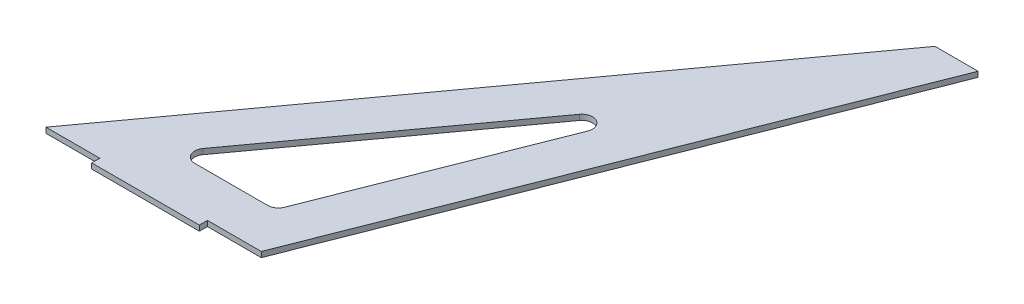
ISO-10303-21;
HEADER;
FILE_DESCRIPTION(('STEP AP214'),'2;1');
FILE_NAME('part.step','',(''),(''),'','','');
FILE_SCHEMA(('AUTOMOTIVE_DESIGN { 1 0 10303 214 1 1 1 1 }'));
ENDSEC;
DATA;
#1=APPLICATION_CONTEXT('core data for automotive mechanical design processes');
#2=APPLICATION_PROTOCOL_DEFINITION('international standard','automotive_design',2000,#1);
#3=PRODUCT_CONTEXT('',#1,'mechanical');
#4=PRODUCT('Part','Part','',(#3));
#5=PRODUCT_RELATED_PRODUCT_CATEGORY('part','',(#4));
#6=PRODUCT_DEFINITION_FORMATION('','',#4);
#7=PRODUCT_DEFINITION_CONTEXT('part definition',#1,'design');
#8=PRODUCT_DEFINITION('design','',#6,#7);
#9=PRODUCT_DEFINITION_SHAPE('','',#8);
#10=(LENGTH_UNIT() NAMED_UNIT(*) SI_UNIT(.MILLI.,.METRE.));
#11=(NAMED_UNIT(*) PLANE_ANGLE_UNIT() SI_UNIT($,.RADIAN.));
#12=(NAMED_UNIT(*) SI_UNIT($,.STERADIAN.) SOLID_ANGLE_UNIT());
#13=UNCERTAINTY_MEASURE_WITH_UNIT(LENGTH_MEASURE(1.E-05),#10,'distance_accuracy_value','');
#14=(GEOMETRIC_REPRESENTATION_CONTEXT(3) GLOBAL_UNCERTAINTY_ASSIGNED_CONTEXT((#13)) GLOBAL_UNIT_ASSIGNED_CONTEXT((#10,
#11,#12)) REPRESENTATION_CONTEXT('',''));
#15=CARTESIAN_POINT('',(0.,0.,0.));
#16=DIRECTION('',(0.,0.,1.));
#17=DIRECTION('',(1.,0.,0.));
#18=AXIS2_PLACEMENT_3D('',#15,#16,#17);
#19=CARTESIAN_POINT('',(-119.32539,3.175,0.));
#20=DIRECTION('',(0.,0.,-1.));
#21=DIRECTION('',(-1.,0.,0.));
#22=AXIS2_PLACEMENT_3D('',#19,#20,#21);
#23=PLANE('',#22);
#24=DIRECTION('',(0.,1.,0.));
#25=VECTOR('',#24,1.);
#26=CARTESIAN_POINT('',(-151.07539,3.175,0.));
#27=LINE('',#26,#25);
#28=CARTESIAN_POINT('',(-151.07539,0.,0.));
#29=VERTEX_POINT('',#28);
#30=CARTESIAN_POINT('',(-151.07539,3.175,0.));
#31=VERTEX_POINT('',#30);
#32=EDGE_CURVE('E161',#29,#31,#27,.T.);
#33=ORIENTED_EDGE('',*,*,#32,.F.);
#34=DIRECTION('',(1.,0.,0.));
#35=VECTOR('',#34,1.);
#36=CARTESIAN_POINT('',(-119.32539,0.,0.));
#37=LINE('',#36,#35);
#38=CARTESIAN_POINT('',(-119.32539,0.,0.));
#39=VERTEX_POINT('',#38);
#40=EDGE_CURVE('E202',#29,#39,#37,.T.);
#41=ORIENTED_EDGE('',*,*,#40,.T.);
#42=DIRECTION('',(0.,-1.,0.));
#43=VECTOR('',#42,1.);
#44=CARTESIAN_POINT('',(-119.32539,3.175,0.));
#45=LINE('',#44,#43);
#46=CARTESIAN_POINT('',(-119.32539,3.175,0.));
#47=VERTEX_POINT('',#46);
#48=EDGE_CURVE('E195',#47,#39,#45,.T.);
#49=ORIENTED_EDGE('',*,*,#48,.F.);
#50=DIRECTION('',(1.,0.,0.));
#51=VECTOR('',#50,1.);
#52=CARTESIAN_POINT('',(-119.32539,3.175,0.));
#53=LINE('',#52,#51);
#54=EDGE_CURVE('E53',#31,#47,#53,.T.);
#55=ORIENTED_EDGE('',*,*,#54,.F.);
#56=EDGE_LOOP('',(#33,#41,#49,#55));
#57=FACE_BOUND('',#56,.T.);
#58=ADVANCED_FACE('F38',(#57),#23,.F.);
#59=DIRECTION('',(0.,-1.,0.));
#60=VECTOR('',#59,1.);
#61=CARTESIAN_POINT('',(-214.57539,3.175,0.));
#62=LINE('',#61,#60);
#63=CARTESIAN_POINT('',(-214.57539,3.175,0.));
#64=VERTEX_POINT('',#63);
#65=CARTESIAN_POINT('',(-214.57539,0.,0.));
#66=VERTEX_POINT('',#65);
#67=EDGE_CURVE('E61',#64,#66,#62,.T.);
#68=ORIENTED_EDGE('',*,*,#67,.F.);
#69=CARTESIAN_POINT('',(-246.32539,3.175,0.));
#70=VERTEX_POINT('',#69);
#71=EDGE_CURVE('E193',#70,#64,#53,.T.);
#72=ORIENTED_EDGE('',*,*,#71,.F.);
#73=DIRECTION('',(0.,-1.,0.));
#74=VECTOR('',#73,1.);
#75=CARTESIAN_POINT('',(-246.32539,3.175,0.));
#76=LINE('',#75,#74);
#77=CARTESIAN_POINT('',(-246.32539,0.,0.));
#78=VERTEX_POINT('',#77);
#79=EDGE_CURVE('E206',#70,#78,#76,.T.);
#80=ORIENTED_EDGE('',*,*,#79,.T.);
#81=EDGE_CURVE('E189',#78,#66,#37,.T.);
#82=ORIENTED_EDGE('',*,*,#81,.T.);
#83=EDGE_LOOP('',(#68,#72,#80,#82));
#84=FACE_BOUND('',#83,.T.);
#85=ADVANCED_FACE('F276',(#84),#23,.F.);
#86=CARTESIAN_POINT('',(0.,3.175,-303.52288512952));
#87=DIRECTION('',(-0.930663542600388,0.,-0.365876168224299));
#88=DIRECTION('',(-0.365876168224299,0.,0.930663542600388));
#89=AXIS2_PLACEMENT_3D('',#86,#87,#88);
#90=PLANE('',#89);
#91=DIRECTION('',(0.365876168224299,0.,-0.930663542600388));
#92=VECTOR('',#91,1.);
#93=CARTESIAN_POINT('',(0.,0.,-303.52288512952));
#94=LINE('',#93,#92);
#95=CARTESIAN_POINT('',(0.,0.,-303.52288512952));
#96=VERTEX_POINT('',#95);
#97=EDGE_CURVE('E180',#39,#96,#94,.T.);
#98=ORIENTED_EDGE('',*,*,#97,.T.);
#99=DIRECTION('',(0.,-1.,0.));
#100=VECTOR('',#99,1.);
#101=CARTESIAN_POINT('',(0.,3.175,-303.52288512952));
#102=LINE('',#101,#100);
#103=CARTESIAN_POINT('',(0.,3.175,-303.52288512952));
#104=VERTEX_POINT('',#103);
#105=EDGE_CURVE('E212',#104,#96,#102,.T.);
#106=ORIENTED_EDGE('',*,*,#105,.F.);
#107=DIRECTION('',(0.365876168224299,0.,-0.930663542600388));
#108=VECTOR('',#107,1.);
#109=CARTESIAN_POINT('',(0.,3.175,-303.52288512952));
#110=LINE('',#109,#108);
#111=EDGE_CURVE('E186',#47,#104,#110,.T.);
#112=ORIENTED_EDGE('',*,*,#111,.F.);
#113=ORIENTED_EDGE('',*,*,#48,.T.);
#114=EDGE_LOOP('',(#98,#106,#112,#113));
#115=FACE_BOUND('',#114,.T.);
#116=ADVANCED_FACE('F281',(#115),#90,.F.);
#117=CARTESIAN_POINT('',(-25.4,3.175,-303.52288512952));
#118=DIRECTION('',(0.,0.,1.));
#119=DIRECTION('',(1.,0.,0.));
#120=AXIS2_PLACEMENT_3D('',#117,#118,#119);
#121=PLANE('',#120);
#122=DIRECTION('',(-1.,0.,0.));
#123=VECTOR('',#122,1.);
#124=CARTESIAN_POINT('',(-25.4,0.,-303.52288512952));
#125=LINE('',#124,#123);
#126=CARTESIAN_POINT('',(-25.4,0.,-303.52288512952));
#127=VERTEX_POINT('',#126);
#128=EDGE_CURVE('E198',#96,#127,#125,.T.);
#129=ORIENTED_EDGE('',*,*,#128,.T.);
#130=DIRECTION('',(0.,-1.,0.));
#131=VECTOR('',#130,1.);
#132=CARTESIAN_POINT('',(-25.4,3.175,-303.52288512952));
#133=LINE('',#132,#131);
#134=CARTESIAN_POINT('',(-25.4,3.175,-303.52288512952));
#135=VERTEX_POINT('',#134);
#136=EDGE_CURVE('E209',#135,#127,#133,.T.);
#137=ORIENTED_EDGE('',*,*,#136,.F.);
#138=DIRECTION('',(-1.,0.,0.));
#139=VECTOR('',#138,1.);
#140=CARTESIAN_POINT('',(-25.4,3.175,-303.52288512952));
#141=LINE('',#140,#139);
#142=EDGE_CURVE('E188',#104,#135,#141,.T.);
#143=ORIENTED_EDGE('',*,*,#142,.F.);
#144=ORIENTED_EDGE('',*,*,#105,.T.);
#145=EDGE_LOOP('',(#129,#137,#143,#144));
#146=FACE_BOUND('',#145,.T.);
#147=ADVANCED_FACE('F288',(#146),#121,.F.);
#148=CARTESIAN_POINT('',(-246.32539,3.175,0.));
#149=DIRECTION('',(0.808506081663666,0.,0.588487821380243));
#150=DIRECTION('',(0.588487821380244,0.,-0.808506081663666));
#151=AXIS2_PLACEMENT_3D('',#148,#149,#150);
#152=PLANE('',#151);
#153=DIRECTION('',(-0.588487821380243,0.,0.808506081663666));
#154=VECTOR('',#153,1.);
#155=CARTESIAN_POINT('',(-246.32539,0.,0.));
#156=LINE('',#155,#154);
#157=EDGE_CURVE('E200',#127,#78,#156,.T.);
#158=ORIENTED_EDGE('',*,*,#157,.T.);
#159=ORIENTED_EDGE('',*,*,#79,.F.);
#160=DIRECTION('',(-0.588487821380243,0.,0.808506081663666));
#161=VECTOR('',#160,1.);
#162=CARTESIAN_POINT('',(-246.32539,3.175,0.));
#163=LINE('',#162,#161);
#164=EDGE_CURVE('E191',#135,#70,#163,.T.);
#165=ORIENTED_EDGE('',*,*,#164,.F.);
#166=ORIENTED_EDGE('',*,*,#136,.T.);
#167=EDGE_LOOP('',(#158,#159,#165,#166));
#168=FACE_BOUND('',#167,.T.);
#169=ADVANCED_FACE('F285',(#168),#152,.F.);
#170=CARTESIAN_POINT('',(0.,3.175,0.));
#171=DIRECTION('',(0.,-1.,0.));
#172=DIRECTION('',(0.,0.,-1.));
#173=AXIS2_PLACEMENT_3D('',#170,#171,#172);
#174=PLANE('',#173);
#175=DIRECTION('',(0.3658761682243,0.,-0.930663542600388));
#176=VECTOR('',#175,1.);
#177=CARTESIAN_POINT('',(-136.632122873728,3.175,-25.4));
#178=LINE('',#177,#176);
#179=CARTESIAN_POINT('',(-135.049092596648,3.175,-29.4266863317757));
#180=VERTEX_POINT('',#179);
#181=CARTESIAN_POINT('',(-84.5627859593246,3.175,-157.846542743677));
#182=VERTEX_POINT('',#181);
#183=EDGE_CURVE('E165',#180,#182,#178,.T.);
#184=ORIENTED_EDGE('',*,*,#183,.F.);
#185=CARTESIAN_POINT('',(-140.958806092161,3.175,-31.75));
#186=DIRECTION('',(0.,-1.,0.));
#187=DIRECTION('',(0.,0.,-1.));
#188=AXIS2_PLACEMENT_3D('',#185,#186,#187);
#189=CIRCLE('',#188,6.35);
#190=CARTESIAN_POINT('',(-140.958806092161,3.175,-25.4));
#191=VERTEX_POINT('',#190);
#192=EDGE_CURVE('E230',#180,#191,#189,.T.);
#193=ORIENTED_EDGE('',*,*,#192,.T.);
#194=DIRECTION('',(1.,0.,0.));
#195=VECTOR('',#194,1.);
#196=CARTESIAN_POINT('',(-196.42150977187,3.175,-25.4));
#197=LINE('',#196,#195);
#198=CARTESIAN_POINT('',(-183.945539714838,3.175,-25.4));
#199=VERTEX_POINT('',#198);
#200=EDGE_CURVE('E162',#199,#191,#197,.T.);
#201=ORIENTED_EDGE('',*,*,#200,.F.);
#202=CARTESIAN_POINT('',(-183.945539714838,3.175,-31.75));
#203=DIRECTION('',(0.,-1.,0.));
#204=DIRECTION('',(0.,0.,-1.));
#205=AXIS2_PLACEMENT_3D('',#202,#203,#204);
#206=CIRCLE('',#205,6.35);
#207=CARTESIAN_POINT('',(-189.079553333402,3.175,-35.4868976657646));
#208=VERTEX_POINT('',#207);
#209=EDGE_CURVE('E234',#199,#208,#206,.T.);
#210=ORIENTED_EDGE('',*,*,#209,.T.);
#211=DIRECTION('',(-0.588487821380243,0.,0.808506081663666));
#212=VECTOR('',#211,1.);
#213=CARTESIAN_POINT('',(-66.4117300638694,3.175,-204.016606411901));
#214=LINE('',#213,#212);
#215=CARTESIAN_POINT('',(-95.6065130734013,3.175,-163.906754077666));
#216=VERTEX_POINT('',#215);
#217=EDGE_CURVE('E175',#216,#208,#214,.T.);
#218=ORIENTED_EDGE('',*,*,#217,.F.);
#219=CARTESIAN_POINT('',(-90.472499454837,3.175,-160.169856411901));
#220=DIRECTION('',(0.,-1.,0.));
#221=DIRECTION('',(0.,0.,-1.));
#222=AXIS2_PLACEMENT_3D('',#219,#220,#221);
#223=CIRCLE('',#222,6.35);
#224=EDGE_CURVE('E46',#216,#182,#223,.T.);
#225=ORIENTED_EDGE('',*,*,#224,.T.);
#226=EDGE_LOOP('',(#184,#193,#201,#210,#218,#225));
#227=FACE_BOUND('',#226,.T.);
#228=ORIENTED_EDGE('',*,*,#111,.T.);
#229=ORIENTED_EDGE('',*,*,#142,.T.);
#230=ORIENTED_EDGE('',*,*,#164,.T.);
#231=ORIENTED_EDGE('',*,*,#71,.T.);
#232=DIRECTION('',(0.,0.,-1.));
#233=VECTOR('',#232,1.);
#234=CARTESIAN_POINT('',(-214.57539,3.175,4.7625));
#235=LINE('',#234,#233);
#236=CARTESIAN_POINT('',(-214.57539,3.175,4.7625));
#237=VERTEX_POINT('',#236);
#238=EDGE_CURVE('E146',#237,#64,#235,.T.);
#239=ORIENTED_EDGE('',*,*,#238,.F.);
#240=DIRECTION('',(-1.,0.,0.));
#241=VECTOR('',#240,1.);
#242=CARTESIAN_POINT('',(-214.57539,3.175,4.7625));
#243=LINE('',#242,#241);
#244=CARTESIAN_POINT('',(-151.07539,3.175,4.7625));
#245=VERTEX_POINT('',#244);
#246=EDGE_CURVE('E138',#245,#237,#243,.T.);
#247=ORIENTED_EDGE('',*,*,#246,.F.);
#248=DIRECTION('',(0.,0.,-1.));
#249=VECTOR('',#248,1.);
#250=CARTESIAN_POINT('',(-151.07539,3.175,4.7625));
#251=LINE('',#250,#249);
#252=EDGE_CURVE('E143',#245,#31,#251,.T.);
#253=ORIENTED_EDGE('',*,*,#252,.T.);
#254=ORIENTED_EDGE('',*,*,#54,.T.);
#255=EDGE_LOOP('',(#228,#229,#230,#231,#239,#247,#253,#254));
#256=FACE_BOUND('',#255,.T.);
#257=ADVANCED_FACE('F141',(#227,#256),#174,.F.);
#258=CARTESIAN_POINT('',(0.,0.,0.));
#259=DIRECTION('',(0.,-1.,0.));
#260=DIRECTION('',(0.,0.,-1.));
#261=AXIS2_PLACEMENT_3D('',#258,#259,#260);
#262=PLANE('',#261);
#263=DIRECTION('',(-0.588487821380243,0.,0.808506081663666));
#264=VECTOR('',#263,1.);
#265=CARTESIAN_POINT('',(-66.4117300638694,0.,-204.016606411901));
#266=LINE('',#265,#264);
#267=CARTESIAN_POINT('',(-95.6065130734013,0.,-163.906754077666));
#268=VERTEX_POINT('',#267);
#269=CARTESIAN_POINT('',(-189.079553333402,0.,-35.4868976657646));
#270=VERTEX_POINT('',#269);
#271=EDGE_CURVE('E178',#268,#270,#266,.T.);
#272=ORIENTED_EDGE('',*,*,#271,.T.);
#273=CARTESIAN_POINT('',(-183.945539714838,0.,-31.75));
#274=DIRECTION('',(0.,-1.,0.));
#275=DIRECTION('',(0.,0.,-1.));
#276=AXIS2_PLACEMENT_3D('',#273,#274,#275);
#277=CIRCLE('',#276,6.35);
#278=CARTESIAN_POINT('',(-183.945539714838,0.,-25.4));
#279=VERTEX_POINT('',#278);
#280=EDGE_CURVE('E236',#270,#279,#277,.F.);
#281=ORIENTED_EDGE('',*,*,#280,.T.);
#282=DIRECTION('',(1.,0.,0.));
#283=VECTOR('',#282,1.);
#284=CARTESIAN_POINT('',(-196.42150977187,0.,-25.4));
#285=LINE('',#284,#283);
#286=CARTESIAN_POINT('',(-140.958806092161,0.,-25.4));
#287=VERTEX_POINT('',#286);
#288=EDGE_CURVE('E171',#279,#287,#285,.T.);
#289=ORIENTED_EDGE('',*,*,#288,.T.);
#290=CARTESIAN_POINT('',(-140.958806092161,0.,-31.75));
#291=DIRECTION('',(0.,-1.,0.));
#292=DIRECTION('',(0.,0.,-1.));
#293=AXIS2_PLACEMENT_3D('',#290,#291,#292);
#294=CIRCLE('',#293,6.35);
#295=CARTESIAN_POINT('',(-135.049092596648,0.,-29.4266863317757));
#296=VERTEX_POINT('',#295);
#297=EDGE_CURVE('E232',#287,#296,#294,.F.);
#298=ORIENTED_EDGE('',*,*,#297,.T.);
#299=DIRECTION('',(0.3658761682243,0.,-0.930663542600388));
#300=VECTOR('',#299,1.);
#301=CARTESIAN_POINT('',(-136.632122873728,0.,-25.4));
#302=LINE('',#301,#300);
#303=CARTESIAN_POINT('',(-84.5627859593246,0.,-157.846542743677));
#304=VERTEX_POINT('',#303);
#305=EDGE_CURVE('E174',#296,#304,#302,.T.);
#306=ORIENTED_EDGE('',*,*,#305,.T.);
#307=CARTESIAN_POINT('',(-90.472499454837,0.,-160.169856411901));
#308=DIRECTION('',(0.,-1.,0.));
#309=DIRECTION('',(0.,0.,-1.));
#310=AXIS2_PLACEMENT_3D('',#307,#308,#309);
#311=CIRCLE('',#310,6.35);
#312=EDGE_CURVE('E11',#304,#268,#311,.F.);
#313=ORIENTED_EDGE('',*,*,#312,.T.);
#314=EDGE_LOOP('',(#272,#281,#289,#298,#306,#313));
#315=FACE_BOUND('',#314,.T.);
#316=ORIENTED_EDGE('',*,*,#97,.F.);
#317=ORIENTED_EDGE('',*,*,#40,.F.);
#318=DIRECTION('',(0.,0.,-1.));
#319=VECTOR('',#318,1.);
#320=CARTESIAN_POINT('',(-151.07539,0.,4.7625));
#321=LINE('',#320,#319);
#322=CARTESIAN_POINT('',(-151.07539,0.,4.7625));
#323=VERTEX_POINT('',#322);
#324=EDGE_CURVE('E309',#323,#29,#321,.T.);
#325=ORIENTED_EDGE('',*,*,#324,.F.);
#326=DIRECTION('',(1.,0.,0.));
#327=VECTOR('',#326,1.);
#328=CARTESIAN_POINT('',(-214.57539,0.,4.7625));
#329=LINE('',#328,#327);
#330=CARTESIAN_POINT('',(-214.57539,0.,4.7625));
#331=VERTEX_POINT('',#330);
#332=EDGE_CURVE('E155',#331,#323,#329,.T.);
#333=ORIENTED_EDGE('',*,*,#332,.F.);
#334=DIRECTION('',(0.,0.,-1.));
#335=VECTOR('',#334,1.);
#336=CARTESIAN_POINT('',(-214.57539,0.,4.7625));
#337=LINE('',#336,#335);
#338=EDGE_CURVE('E167',#331,#66,#337,.T.);
#339=ORIENTED_EDGE('',*,*,#338,.T.);
#340=ORIENTED_EDGE('',*,*,#81,.F.);
#341=ORIENTED_EDGE('',*,*,#157,.F.);
#342=ORIENTED_EDGE('',*,*,#128,.F.);
#343=EDGE_LOOP('',(#316,#317,#325,#333,#339,#340,#341,#342));
#344=FACE_BOUND('',#343,.T.);
#345=ADVANCED_FACE('F250',(#315,#344),#262,.T.);
#346=CARTESIAN_POINT('',(-196.42150977187,0.,-25.4));
#347=DIRECTION('',(0.,0.,1.));
#348=DIRECTION('',(1.,0.,0.));
#349=AXIS2_PLACEMENT_3D('',#346,#347,#348);
#350=PLANE('',#349);
#351=ORIENTED_EDGE('',*,*,#200,.T.);
#352=DIRECTION('',(0.,1.,0.));
#353=VECTOR('',#352,1.);
#354=CARTESIAN_POINT('',(-140.958806092161,0.,-25.4));
#355=LINE('',#354,#353);
#356=EDGE_CURVE('E223',#191,#287,#355,.F.);
#357=ORIENTED_EDGE('',*,*,#356,.T.);
#358=ORIENTED_EDGE('',*,*,#288,.F.);
#359=DIRECTION('',(0.,1.,0.));
#360=VECTOR('',#359,1.);
#361=CARTESIAN_POINT('',(-183.945539714838,3.175,-25.4));
#362=LINE('',#361,#360);
#363=EDGE_CURVE('E220',#279,#199,#362,.T.);
#364=ORIENTED_EDGE('',*,*,#363,.T.);
#365=EDGE_LOOP('',(#351,#357,#358,#364));
#366=FACE_BOUND('',#365,.T.);
#367=ADVANCED_FACE('F262',(#366),#350,.F.);
#368=CARTESIAN_POINT('',(-66.4117300638694,0.,-204.016606411901));
#369=DIRECTION('',(-0.808506081663666,0.,-0.588487821380243));
#370=DIRECTION('',(-0.588487821380243,0.,0.808506081663667));
#371=AXIS2_PLACEMENT_3D('',#368,#369,#370);
#372=PLANE('',#371);
#373=ORIENTED_EDGE('',*,*,#217,.T.);
#374=DIRECTION('',(0.,1.,0.));
#375=VECTOR('',#374,1.);
#376=CARTESIAN_POINT('',(-189.079553333402,0.,-35.4868976657646));
#377=LINE('',#376,#375);
#378=EDGE_CURVE('E228',#208,#270,#377,.F.);
#379=ORIENTED_EDGE('',*,*,#378,.T.);
#380=ORIENTED_EDGE('',*,*,#271,.F.);
#381=DIRECTION('',(0.,1.,0.));
#382=VECTOR('',#381,1.);
#383=CARTESIAN_POINT('',(-95.6065130734013,3.175,-163.906754077666));
#384=LINE('',#383,#382);
#385=EDGE_CURVE('E225',#268,#216,#384,.T.);
#386=ORIENTED_EDGE('',*,*,#385,.T.);
#387=EDGE_LOOP('',(#373,#379,#380,#386));
#388=FACE_BOUND('',#387,.T.);
#389=ADVANCED_FACE('F254',(#388),#372,.F.);
#390=CARTESIAN_POINT('',(-136.632122873728,0.,-25.4));
#391=DIRECTION('',(0.930663542600388,0.,0.3658761682243));
#392=DIRECTION('',(0.3658761682243,0.,-0.930663542600388));
#393=AXIS2_PLACEMENT_3D('',#390,#391,#392);
#394=PLANE('',#393);
#395=ORIENTED_EDGE('',*,*,#305,.F.);
#396=DIRECTION('',(0.,1.,0.));
#397=VECTOR('',#396,1.);
#398=CARTESIAN_POINT('',(-135.049092596648,3.175,-29.4266863317757));
#399=LINE('',#398,#397);
#400=EDGE_CURVE('E217',#296,#180,#399,.T.);
#401=ORIENTED_EDGE('',*,*,#400,.T.);
#402=ORIENTED_EDGE('',*,*,#183,.T.);
#403=DIRECTION('',(0.,1.,0.));
#404=VECTOR('',#403,1.);
#405=CARTESIAN_POINT('',(-84.5627859593246,0.,-157.846542743677));
#406=LINE('',#405,#404);
#407=EDGE_CURVE('E215',#182,#304,#406,.F.);
#408=ORIENTED_EDGE('',*,*,#407,.T.);
#409=EDGE_LOOP('',(#395,#401,#402,#408));
#410=FACE_BOUND('',#409,.T.);
#411=ADVANCED_FACE('F245',(#410),#394,.F.);
#412=CARTESIAN_POINT('',(-140.958806092161,0.,-31.75));
#413=DIRECTION('',(0.,-1.,0.));
#414=DIRECTION('',(0.,0.,-1.));
#415=AXIS2_PLACEMENT_3D('',#412,#413,#414);
#416=CYLINDRICAL_SURFACE('',#415,6.35);
#417=ORIENTED_EDGE('',*,*,#297,.F.);
#418=ORIENTED_EDGE('',*,*,#356,.F.);
#419=ORIENTED_EDGE('',*,*,#192,.F.);
#420=ORIENTED_EDGE('',*,*,#400,.F.);
#421=EDGE_LOOP('',(#417,#418,#419,#420));
#422=FACE_BOUND('',#421,.T.);
#423=ADVANCED_FACE('F266',(#422),#416,.F.);
#424=CARTESIAN_POINT('',(-183.945539714838,0.,-31.75));
#425=DIRECTION('',(0.,-1.,0.));
#426=DIRECTION('',(0.,0.,-1.));
#427=AXIS2_PLACEMENT_3D('',#424,#425,#426);
#428=CYLINDRICAL_SURFACE('',#427,6.35);
#429=ORIENTED_EDGE('',*,*,#280,.F.);
#430=ORIENTED_EDGE('',*,*,#378,.F.);
#431=ORIENTED_EDGE('',*,*,#209,.F.);
#432=ORIENTED_EDGE('',*,*,#363,.F.);
#433=EDGE_LOOP('',(#429,#430,#431,#432));
#434=FACE_BOUND('',#433,.T.);
#435=ADVANCED_FACE('F257',(#434),#428,.F.);
#436=CARTESIAN_POINT('',(-90.472499454837,0.,-160.169856411901));
#437=DIRECTION('',(0.,-1.,0.));
#438=DIRECTION('',(0.,0.,-1.));
#439=AXIS2_PLACEMENT_3D('',#436,#437,#438);
#440=CYLINDRICAL_SURFACE('',#439,6.35);
#441=ORIENTED_EDGE('',*,*,#312,.F.);
#442=ORIENTED_EDGE('',*,*,#407,.F.);
#443=ORIENTED_EDGE('',*,*,#224,.F.);
#444=ORIENTED_EDGE('',*,*,#385,.F.);
#445=EDGE_LOOP('',(#441,#442,#443,#444));
#446=FACE_BOUND('',#445,.T.);
#447=ADVANCED_FACE('F40',(#446),#440,.F.);
#448=CARTESIAN_POINT('',(-151.07539,3.175,4.7625));
#449=DIRECTION('',(-1.,0.,0.));
#450=DIRECTION('',(0.,0.,1.));
#451=AXIS2_PLACEMENT_3D('',#448,#449,#450);
#452=PLANE('',#451);
#453=ORIENTED_EDGE('',*,*,#32,.T.);
#454=ORIENTED_EDGE('',*,*,#252,.F.);
#455=DIRECTION('',(0.,1.,0.));
#456=VECTOR('',#455,1.);
#457=CARTESIAN_POINT('',(-151.07539,3.175,4.7625));
#458=LINE('',#457,#456);
#459=EDGE_CURVE('E150',#323,#245,#458,.T.);
#460=ORIENTED_EDGE('',*,*,#459,.F.);
#461=ORIENTED_EDGE('',*,*,#324,.T.);
#462=EDGE_LOOP('',(#453,#454,#460,#461));
#463=FACE_BOUND('',#462,.T.);
#464=ADVANCED_FACE('F160',(#463),#452,.F.);
#465=CARTESIAN_POINT('',(-214.57539,3.175,4.7625));
#466=DIRECTION('',(1.,0.,0.));
#467=DIRECTION('',(0.,0.,-1.));
#468=AXIS2_PLACEMENT_3D('',#465,#466,#467);
#469=PLANE('',#468);
#470=ORIENTED_EDGE('',*,*,#67,.T.);
#471=ORIENTED_EDGE('',*,*,#338,.F.);
#472=DIRECTION('',(0.,-1.,0.));
#473=VECTOR('',#472,1.);
#474=CARTESIAN_POINT('',(-214.57539,3.175,4.7625));
#475=LINE('',#474,#473);
#476=EDGE_CURVE('E149',#237,#331,#475,.T.);
#477=ORIENTED_EDGE('',*,*,#476,.F.);
#478=ORIENTED_EDGE('',*,*,#238,.T.);
#479=EDGE_LOOP('',(#470,#471,#477,#478));
#480=FACE_BOUND('',#479,.T.);
#481=ADVANCED_FACE('F313',(#480),#469,.F.);
#482=CARTESIAN_POINT('',(0.,0.,4.7625));
#483=DIRECTION('',(0.,0.,1.));
#484=DIRECTION('',(1.,0.,0.));
#485=AXIS2_PLACEMENT_3D('',#482,#483,#484);
#486=PLANE('',#485);
#487=ORIENTED_EDGE('',*,*,#459,.T.);
#488=ORIENTED_EDGE('',*,*,#246,.T.);
#489=ORIENTED_EDGE('',*,*,#476,.T.);
#490=ORIENTED_EDGE('',*,*,#332,.T.);
#491=EDGE_LOOP('',(#487,#488,#489,#490));
#492=FACE_BOUND('',#491,.T.);
#493=ADVANCED_FACE('F153',(#492),#486,.T.);
#494=CLOSED_SHELL('',(#58,#85,#116,#147,#169,#257,#345,#367,#389,#411,#423,#435,#447,#464,#481,#493));
#495=MANIFOLD_SOLID_BREP('B2',#494);
#496=ADVANCED_BREP_SHAPE_REPRESENTATION('',(#18,#495),#14);
#497=SHAPE_DEFINITION_REPRESENTATION(#9,#496);
ENDSEC;
END-ISO-10303-21;
